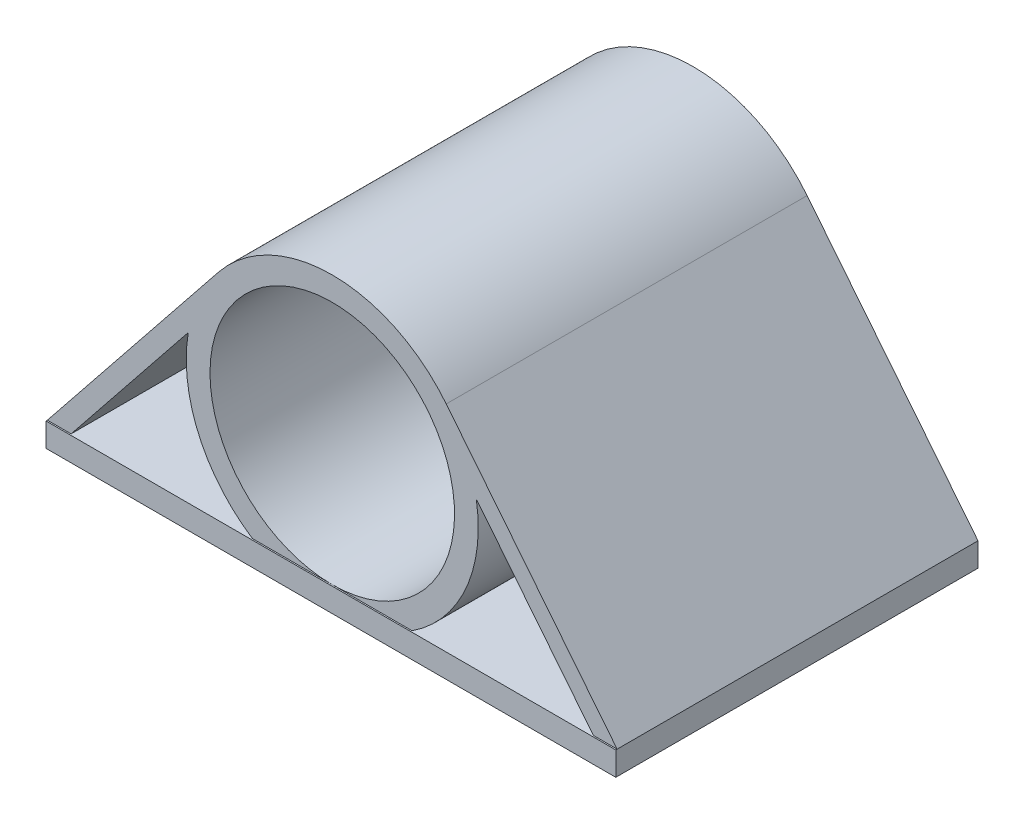
ISO-10303-21;
HEADER;
FILE_DESCRIPTION(('STEP AP214'),'2;1');
FILE_NAME('part.step','',(''),(''),'','','');
FILE_SCHEMA(('AUTOMOTIVE_DESIGN { 1 0 10303 214 1 1 1 1 }'));
ENDSEC;
DATA;
#1=APPLICATION_CONTEXT('core data for automotive mechanical design processes');
#2=APPLICATION_PROTOCOL_DEFINITION('international standard','automotive_design',2000,#1);
#3=PRODUCT_CONTEXT('',#1,'mechanical');
#4=PRODUCT('Part','Part','',(#3));
#5=PRODUCT_RELATED_PRODUCT_CATEGORY('part','',(#4));
#6=PRODUCT_DEFINITION_FORMATION('','',#4);
#7=PRODUCT_DEFINITION_CONTEXT('part definition',#1,'design');
#8=PRODUCT_DEFINITION('design','',#6,#7);
#9=PRODUCT_DEFINITION_SHAPE('','',#8);
#10=(LENGTH_UNIT() NAMED_UNIT(*) SI_UNIT(.MILLI.,.METRE.));
#11=(NAMED_UNIT(*) PLANE_ANGLE_UNIT() SI_UNIT($,.RADIAN.));
#12=(NAMED_UNIT(*) SI_UNIT($,.STERADIAN.) SOLID_ANGLE_UNIT());
#13=UNCERTAINTY_MEASURE_WITH_UNIT(LENGTH_MEASURE(1.E-05),#10,'distance_accuracy_value','');
#14=(GEOMETRIC_REPRESENTATION_CONTEXT(3) GLOBAL_UNCERTAINTY_ASSIGNED_CONTEXT((#13)) GLOBAL_UNIT_ASSIGNED_CONTEXT((#10,
#11,#12)) REPRESENTATION_CONTEXT('',''));
#15=CARTESIAN_POINT('',(0.,0.,0.));
#16=DIRECTION('',(0.,0.,1.));
#17=DIRECTION('',(1.,0.,0.));
#18=AXIS2_PLACEMENT_3D('',#15,#16,#17);
#19=CARTESIAN_POINT('',(0.,0.,76.));
#20=DIRECTION('',(0.,0.,-1.));
#21=DIRECTION('',(-1.,0.,0.));
#22=AXIS2_PLACEMENT_3D('',#19,#20,#21);
#23=CYLINDRICAL_SURFACE('',#22,30.75);
#24=CARTESIAN_POINT('',(0.,0.,0.));
#25=DIRECTION('',(0.,0.,1.));
#26=DIRECTION('',(1.,0.,0.));
#27=AXIS2_PLACEMENT_3D('',#24,#25,#26);
#28=CIRCLE('',#27,30.75);
#29=CARTESIAN_POINT('',(24.0063013122993,19.216138980115,0.));
#30=VERTEX_POINT('',#29);
#31=CARTESIAN_POINT('',(-24.0063013122988,19.2161389801157,0.));
#32=VERTEX_POINT('',#31);
#33=EDGE_CURVE('E166',#30,#32,#28,.T.);
#34=ORIENTED_EDGE('',*,*,#33,.T.);
#35=DIRECTION('',(0.,0.,1.));
#36=VECTOR('',#35,1.);
#37=CARTESIAN_POINT('',(-24.0063013122988,19.2161389801157,0.));
#38=LINE('',#37,#36);
#39=CARTESIAN_POINT('',(-24.0063013122988,19.2161389801157,76.));
#40=VERTEX_POINT('',#39);
#41=EDGE_CURVE('E162',#32,#40,#38,.T.);
#42=ORIENTED_EDGE('',*,*,#41,.T.);
#43=CARTESIAN_POINT('',(0.,0.,76.));
#44=DIRECTION('',(0.,0.,1.));
#45=DIRECTION('',(1.,0.,0.));
#46=AXIS2_PLACEMENT_3D('',#43,#44,#45);
#47=CIRCLE('',#46,30.75);
#48=CARTESIAN_POINT('',(24.0063013122993,19.216138980115,76.));
#49=VERTEX_POINT('',#48);
#50=EDGE_CURVE('E52',#49,#40,#47,.T.);
#51=ORIENTED_EDGE('',*,*,#50,.F.);
#52=DIRECTION('',(0.,0.,1.));
#53=VECTOR('',#52,1.);
#54=CARTESIAN_POINT('',(24.0063013122993,19.216138980115,0.));
#55=LINE('',#54,#53);
#56=EDGE_CURVE('E253',#30,#49,#55,.T.);
#57=ORIENTED_EDGE('',*,*,#56,.F.);
#58=EDGE_LOOP('',(#34,#42,#51,#57));
#59=FACE_BOUND('',#58,.T.);
#60=ADVANCED_FACE('F43',(#59),#23,.T.);
#61=CARTESIAN_POINT('',(-30.3289964603221,5.07094406494202,76.));
#62=VERTEX_POINT('',#61);
#63=CARTESIAN_POINT('',(-16.8077363139716,-25.75,76.));
#64=VERTEX_POINT('',#63);
#65=EDGE_CURVE('E53',#62,#64,#47,.T.);
#66=ORIENTED_EDGE('',*,*,#65,.F.);
#67=DIRECTION('',(0.,0.,1.));
#68=VECTOR('',#67,1.);
#69=CARTESIAN_POINT('',(-30.3289964603221,5.070944064942,0.));
#70=LINE('',#69,#68);
#71=CARTESIAN_POINT('',(-30.3289964603221,5.070944064942,0.));
#72=VERTEX_POINT('',#71);
#73=EDGE_CURVE('E148',#72,#62,#70,.T.);
#74=ORIENTED_EDGE('',*,*,#73,.F.);
#75=CARTESIAN_POINT('',(-16.8077363139716,-25.75,0.));
#76=VERTEX_POINT('',#75);
#77=EDGE_CURVE('E160',#72,#76,#28,.T.);
#78=ORIENTED_EDGE('',*,*,#77,.T.);
#79=DIRECTION('',(0.,0.,-1.));
#80=VECTOR('',#79,1.);
#81=CARTESIAN_POINT('',(-16.8077363139716,-25.75,76.));
#82=LINE('',#81,#80);
#83=EDGE_CURVE('E205',#76,#64,#82,.F.);
#84=ORIENTED_EDGE('',*,*,#83,.T.);
#85=EDGE_LOOP('',(#66,#74,#78,#84));
#86=FACE_BOUND('',#85,.T.);
#87=ADVANCED_FACE('F158',(#86),#23,.T.);
#88=CARTESIAN_POINT('',(0.,0.,76.));
#89=DIRECTION('',(0.,0.,-1.));
#90=DIRECTION('',(-1.,0.,0.));
#91=AXIS2_PLACEMENT_3D('',#88,#89,#90);
#92=CYLINDRICAL_SURFACE('',#91,25.75);
#93=CARTESIAN_POINT('',(0.,0.,5.));
#94=DIRECTION('',(0.,0.,-1.));
#95=DIRECTION('',(-1.,0.,0.));
#96=AXIS2_PLACEMENT_3D('',#93,#94,#95);
#97=CIRCLE('',#96,25.75);
#98=CARTESIAN_POINT('',(-25.75,0.,5.));
#99=VERTEX_POINT('',#98);
#100=EDGE_CURVE('E170',#99,#99,#97,.T.);
#101=ORIENTED_EDGE('',*,*,#100,.T.);
#102=EDGE_LOOP('',(#101));
#103=FACE_BOUND('',#102,.T.);
#104=CARTESIAN_POINT('',(0.,0.,76.));
#105=DIRECTION('',(0.,0.,1.));
#106=DIRECTION('',(1.,0.,0.));
#107=AXIS2_PLACEMENT_3D('',#104,#105,#106);
#108=CIRCLE('',#107,25.75);
#109=CARTESIAN_POINT('',(0.,-25.75,76.));
#110=VERTEX_POINT('',#109);
#111=EDGE_CURVE('E167',#110,#110,#108,.T.);
#112=ORIENTED_EDGE('',*,*,#111,.T.);
#113=EDGE_LOOP('',(#112));
#114=FACE_BOUND('',#113,.T.);
#115=ADVANCED_FACE('F300',(#103,#114),#92,.F.);
#116=CARTESIAN_POINT('',(0.,0.,76.));
#117=DIRECTION('',(0.,0.,1.));
#118=DIRECTION('',(1.,0.,0.));
#119=AXIS2_PLACEMENT_3D('',#116,#117,#118);
#120=PLANE('',#119);
#121=ORIENTED_EDGE('',*,*,#50,.T.);
#122=DIRECTION('',(-0.624915088784227,-0.780692725603231,0.));
#123=VECTOR('',#122,1.);
#124=CARTESIAN_POINT('',(-60.,-25.75,76.));
#125=LINE('',#124,#123);
#126=CARTESIAN_POINT('',(-60.,-25.75,76.));
#127=VERTEX_POINT('',#126);
#128=EDGE_CURVE('E155',#40,#127,#125,.T.);
#129=ORIENTED_EDGE('',*,*,#128,.T.);
#130=DIRECTION('',(1.,0.,0.));
#131=VECTOR('',#130,1.);
#132=CARTESIAN_POINT('',(-60.,-25.75,76.));
#133=LINE('',#132,#131);
#134=CARTESIAN_POINT('',(-54.9999999999985,-25.75,76.));
#135=VERTEX_POINT('',#134);
#136=EDGE_CURVE('E249',#127,#135,#133,.T.);
#137=ORIENTED_EDGE('',*,*,#136,.T.);
#138=DIRECTION('',(0.624915088784227,0.780692725603231,0.));
#139=VECTOR('',#138,1.);
#140=CARTESIAN_POINT('',(-54.9999999999985,-25.75,76.));
#141=LINE('',#140,#139);
#142=EDGE_CURVE('E60',#135,#62,#141,.T.);
#143=ORIENTED_EDGE('',*,*,#142,.T.);
#144=ORIENTED_EDGE('',*,*,#65,.T.);
#145=DIRECTION('',(-1.,0.,0.));
#146=VECTOR('',#145,1.);
#147=CARTESIAN_POINT('',(0.,-25.75,76.));
#148=LINE('',#147,#146);
#149=EDGE_CURVE('E203',#110,#64,#148,.T.);
#150=ORIENTED_EDGE('',*,*,#149,.F.);
#151=ORIENTED_EDGE('',*,*,#111,.F.);
#152=CARTESIAN_POINT('',(16.8077363139716,-25.75,76.));
#153=VERTEX_POINT('',#152);
#154=EDGE_CURVE('E202',#153,#110,#148,.T.);
#155=ORIENTED_EDGE('',*,*,#154,.F.);
#156=CARTESIAN_POINT('',(30.3289964603221,5.070944064942,76.));
#157=VERTEX_POINT('',#156);
#158=EDGE_CURVE('E11',#153,#157,#47,.T.);
#159=ORIENTED_EDGE('',*,*,#158,.T.);
#160=DIRECTION('',(0.624915088784227,-0.780692725603231,0.));
#161=VECTOR('',#160,1.);
#162=CARTESIAN_POINT('',(54.9999999999985,-25.75,76.));
#163=LINE('',#162,#161);
#164=CARTESIAN_POINT('',(54.9999999999985,-25.75,76.));
#165=VERTEX_POINT('',#164);
#166=EDGE_CURVE('E246',#157,#165,#163,.T.);
#167=ORIENTED_EDGE('',*,*,#166,.T.);
#168=DIRECTION('',(1.,0.,0.));
#169=VECTOR('',#168,1.);
#170=CARTESIAN_POINT('',(60.,-25.75,76.));
#171=LINE('',#170,#169);
#172=CARTESIAN_POINT('',(60.,-25.75,76.));
#173=VERTEX_POINT('',#172);
#174=EDGE_CURVE('E250',#165,#173,#171,.T.);
#175=ORIENTED_EDGE('',*,*,#174,.T.);
#176=DIRECTION('',(-0.624915088784227,0.780692725603231,0.));
#177=VECTOR('',#176,1.);
#178=CARTESIAN_POINT('',(60.,-25.75,76.));
#179=LINE('',#178,#177);
#180=EDGE_CURVE('E67',#173,#49,#179,.T.);
#181=ORIENTED_EDGE('',*,*,#180,.T.);
#182=EDGE_LOOP('',(#121,#129,#137,#143,#144,#150,#151,#155,#159,#167,#175,#181));
#183=FACE_BOUND('',#182,.T.);
#184=ADVANCED_FACE('F298',(#183),#120,.T.);
#185=CARTESIAN_POINT('',(0.,0.,0.));
#186=DIRECTION('',(0.,0.,1.));
#187=DIRECTION('',(1.,0.,0.));
#188=AXIS2_PLACEMENT_3D('',#185,#186,#187);
#189=PLANE('',#188);
#190=DIRECTION('',(-0.624915088784227,-0.780692725603231,0.));
#191=VECTOR('',#190,1.);
#192=CARTESIAN_POINT('',(-60.,-25.75,0.));
#193=LINE('',#192,#191);
#194=CARTESIAN_POINT('',(-60.,-25.75,0.));
#195=VERTEX_POINT('',#194);
#196=EDGE_CURVE('E154',#32,#195,#193,.T.);
#197=ORIENTED_EDGE('',*,*,#196,.F.);
#198=ORIENTED_EDGE('',*,*,#33,.F.);
#199=DIRECTION('',(-0.624915088784227,0.780692725603231,0.));
#200=VECTOR('',#199,1.);
#201=CARTESIAN_POINT('',(60.,-25.75,0.));
#202=LINE('',#201,#200);
#203=CARTESIAN_POINT('',(60.,-25.75,0.));
#204=VERTEX_POINT('',#203);
#205=EDGE_CURVE('E243',#204,#30,#202,.T.);
#206=ORIENTED_EDGE('',*,*,#205,.F.);
#207=DIRECTION('',(0.,-1.,0.));
#208=VECTOR('',#207,1.);
#209=CARTESIAN_POINT('',(60.,-25.75,0.));
#210=LINE('',#209,#208);
#211=CARTESIAN_POINT('',(60.,-30.75,0.));
#212=VERTEX_POINT('',#211);
#213=EDGE_CURVE('E213',#204,#212,#210,.T.);
#214=ORIENTED_EDGE('',*,*,#213,.T.);
#215=DIRECTION('',(-1.,0.,0.));
#216=VECTOR('',#215,1.);
#217=CARTESIAN_POINT('',(60.,-30.75,0.));
#218=LINE('',#217,#216);
#219=CARTESIAN_POINT('',(-60.,-30.75,0.));
#220=VERTEX_POINT('',#219);
#221=EDGE_CURVE('E220',#212,#220,#218,.T.);
#222=ORIENTED_EDGE('',*,*,#221,.T.);
#223=DIRECTION('',(0.,-1.,0.));
#224=VECTOR('',#223,1.);
#225=CARTESIAN_POINT('',(-60.,-25.75,0.));
#226=LINE('',#225,#224);
#227=EDGE_CURVE('E216',#195,#220,#226,.T.);
#228=ORIENTED_EDGE('',*,*,#227,.F.);
#229=EDGE_LOOP('',(#197,#198,#206,#214,#222,#228));
#230=FACE_BOUND('',#229,.T.);
#231=DIRECTION('',(0.624915088784227,-0.780692725603231,0.));
#232=VECTOR('',#231,1.);
#233=CARTESIAN_POINT('',(54.9999999999985,-25.75,0.));
#234=LINE('',#233,#232);
#235=CARTESIAN_POINT('',(30.3289964603221,5.070944064942,0.));
#236=VERTEX_POINT('',#235);
#237=CARTESIAN_POINT('',(54.9999999999985,-25.75,0.));
#238=VERTEX_POINT('',#237);
#239=EDGE_CURVE('E240',#236,#238,#234,.T.);
#240=ORIENTED_EDGE('',*,*,#239,.F.);
#241=CARTESIAN_POINT('',(16.8077363139716,-25.75,0.));
#242=VERTEX_POINT('',#241);
#243=EDGE_CURVE('E47',#242,#236,#28,.T.);
#244=ORIENTED_EDGE('',*,*,#243,.F.);
#245=DIRECTION('',(-1.,0.,0.));
#246=VECTOR('',#245,1.);
#247=CARTESIAN_POINT('',(60.,-25.75,0.));
#248=LINE('',#247,#246);
#249=EDGE_CURVE('E219',#238,#242,#248,.T.);
#250=ORIENTED_EDGE('',*,*,#249,.F.);
#251=EDGE_LOOP('',(#240,#244,#250));
#252=FACE_BOUND('',#251,.T.);
#253=CARTESIAN_POINT('',(-20.,0.,0.));
#254=DIRECTION('',(0.,0.,-1.));
#255=DIRECTION('',(-1.,0.,0.));
#256=AXIS2_PLACEMENT_3D('',#253,#254,#255);
#257=CIRCLE('',#256,2.75);
#258=CARTESIAN_POINT('',(-22.75,0.,0.));
#259=VERTEX_POINT('',#258);
#260=EDGE_CURVE('E196',#259,#259,#257,.T.);
#261=ORIENTED_EDGE('',*,*,#260,.F.);
#262=EDGE_LOOP('',(#261));
#263=FACE_BOUND('',#262,.T.);
#264=CARTESIAN_POINT('',(20.,0.,0.));
#265=DIRECTION('',(0.,0.,-1.));
#266=DIRECTION('',(1.,0.,0.));
#267=AXIS2_PLACEMENT_3D('',#264,#265,#266);
#268=CIRCLE('',#267,2.75);
#269=CARTESIAN_POINT('',(22.75,0.,0.));
#270=VERTEX_POINT('',#269);
#271=EDGE_CURVE('E192',#270,#270,#268,.T.);
#272=ORIENTED_EDGE('',*,*,#271,.F.);
#273=EDGE_LOOP('',(#272));
#274=FACE_BOUND('',#273,.T.);
#275=CARTESIAN_POINT('',(0.,0.,0.));
#276=DIRECTION('',(0.,0.,-1.));
#277=DIRECTION('',(-1.,0.,0.));
#278=AXIS2_PLACEMENT_3D('',#275,#276,#277);
#279=CIRCLE('',#278,10.75);
#280=CARTESIAN_POINT('',(-10.75,0.,0.));
#281=VERTEX_POINT('',#280);
#282=EDGE_CURVE('E183',#281,#281,#279,.T.);
#283=ORIENTED_EDGE('',*,*,#282,.F.);
#284=EDGE_LOOP('',(#283));
#285=FACE_BOUND('',#284,.T.);
#286=ORIENTED_EDGE('',*,*,#77,.F.);
#287=DIRECTION('',(0.624915088784227,0.780692725603231,0.));
#288=VECTOR('',#287,1.);
#289=CARTESIAN_POINT('',(-54.9999999999985,-25.75,0.));
#290=LINE('',#289,#288);
#291=CARTESIAN_POINT('',(-54.9999999999985,-25.75,0.));
#292=VERTEX_POINT('',#291);
#293=EDGE_CURVE('E145',#292,#72,#290,.T.);
#294=ORIENTED_EDGE('',*,*,#293,.F.);
#295=EDGE_CURVE('E165',#76,#292,#248,.T.);
#296=ORIENTED_EDGE('',*,*,#295,.F.);
#297=EDGE_LOOP('',(#286,#294,#296));
#298=FACE_BOUND('',#297,.T.);
#299=ADVANCED_FACE('F164',(#230,#252,#263,#274,#285,#298),#189,.F.);
#300=ORIENTED_EDGE('',*,*,#243,.T.);
#301=DIRECTION('',(0.,0.,1.));
#302=VECTOR('',#301,1.);
#303=CARTESIAN_POINT('',(30.3289964603221,5.070944064942,0.));
#304=LINE('',#303,#302);
#305=EDGE_CURVE('E245',#236,#157,#304,.T.);
#306=ORIENTED_EDGE('',*,*,#305,.T.);
#307=ORIENTED_EDGE('',*,*,#158,.F.);
#308=DIRECTION('',(0.,0.,-1.));
#309=VECTOR('',#308,1.);
#310=CARTESIAN_POINT('',(16.8077363139716,-25.75,76.));
#311=LINE('',#310,#309);
#312=EDGE_CURVE('E193',#153,#242,#311,.T.);
#313=ORIENTED_EDGE('',*,*,#312,.T.);
#314=EDGE_LOOP('',(#300,#306,#307,#313));
#315=FACE_BOUND('',#314,.T.);
#316=ADVANCED_FACE('F45',(#315),#23,.T.);
#317=CARTESIAN_POINT('',(0.,0.,5.));
#318=DIRECTION('',(0.,0.,-1.));
#319=DIRECTION('',(-1.,0.,0.));
#320=AXIS2_PLACEMENT_3D('',#317,#318,#319);
#321=PLANE('',#320);
#322=CARTESIAN_POINT('',(-20.,0.,5.));
#323=DIRECTION('',(0.,0.,-1.));
#324=DIRECTION('',(-1.,0.,0.));
#325=AXIS2_PLACEMENT_3D('',#322,#323,#324);
#326=CIRCLE('',#325,2.75);
#327=CARTESIAN_POINT('',(-22.75,0.,5.));
#328=VERTEX_POINT('',#327);
#329=EDGE_CURVE('E186',#328,#328,#326,.T.);
#330=ORIENTED_EDGE('',*,*,#329,.T.);
#331=EDGE_LOOP('',(#330));
#332=FACE_BOUND('',#331,.T.);
#333=CARTESIAN_POINT('',(20.,0.,5.));
#334=DIRECTION('',(0.,0.,-1.));
#335=DIRECTION('',(1.,0.,0.));
#336=AXIS2_PLACEMENT_3D('',#333,#334,#335);
#337=CIRCLE('',#336,2.75);
#338=CARTESIAN_POINT('',(22.75,0.,5.));
#339=VERTEX_POINT('',#338);
#340=EDGE_CURVE('E189',#339,#339,#337,.T.);
#341=ORIENTED_EDGE('',*,*,#340,.T.);
#342=EDGE_LOOP('',(#341));
#343=FACE_BOUND('',#342,.T.);
#344=CARTESIAN_POINT('',(0.,0.,5.));
#345=DIRECTION('',(0.,0.,-1.));
#346=DIRECTION('',(-1.,0.,0.));
#347=AXIS2_PLACEMENT_3D('',#344,#345,#346);
#348=CIRCLE('',#347,10.75);
#349=CARTESIAN_POINT('',(-10.75,0.,5.));
#350=VERTEX_POINT('',#349);
#351=EDGE_CURVE('E182',#350,#350,#348,.T.);
#352=ORIENTED_EDGE('',*,*,#351,.T.);
#353=EDGE_LOOP('',(#352));
#354=FACE_BOUND('',#353,.T.);
#355=ORIENTED_EDGE('',*,*,#100,.F.);
#356=EDGE_LOOP('',(#355));
#357=FACE_BOUND('',#356,.T.);
#358=ADVANCED_FACE('F314',(#332,#343,#354,#357),#321,.F.);
#359=CARTESIAN_POINT('',(0.,0.,5.));
#360=DIRECTION('',(0.,0.,-1.));
#361=DIRECTION('',(-1.,0.,0.));
#362=AXIS2_PLACEMENT_3D('',#359,#360,#361);
#363=CYLINDRICAL_SURFACE('',#362,10.75);
#364=ORIENTED_EDGE('',*,*,#351,.F.);
#365=EDGE_LOOP('',(#364));
#366=FACE_BOUND('',#365,.T.);
#367=ORIENTED_EDGE('',*,*,#282,.T.);
#368=EDGE_LOOP('',(#367));
#369=FACE_BOUND('',#368,.T.);
#370=ADVANCED_FACE('F319',(#366,#369),#363,.F.);
#371=CARTESIAN_POINT('',(20.,0.,5.));
#372=DIRECTION('',(0.,0.,-1.));
#373=DIRECTION('',(-1.,0.,0.));
#374=AXIS2_PLACEMENT_3D('',#371,#372,#373);
#375=CYLINDRICAL_SURFACE('',#374,2.75);
#376=ORIENTED_EDGE('',*,*,#340,.F.);
#377=EDGE_LOOP('',(#376));
#378=FACE_BOUND('',#377,.T.);
#379=ORIENTED_EDGE('',*,*,#271,.T.);
#380=EDGE_LOOP('',(#379));
#381=FACE_BOUND('',#380,.T.);
#382=ADVANCED_FACE('F326',(#378,#381),#375,.F.);
#383=CARTESIAN_POINT('',(-20.,0.,5.));
#384=DIRECTION('',(0.,0.,-1.));
#385=DIRECTION('',(-1.,0.,0.));
#386=AXIS2_PLACEMENT_3D('',#383,#384,#385);
#387=CYLINDRICAL_SURFACE('',#386,2.75);
#388=ORIENTED_EDGE('',*,*,#329,.F.);
#389=EDGE_LOOP('',(#388));
#390=FACE_BOUND('',#389,.T.);
#391=ORIENTED_EDGE('',*,*,#260,.T.);
#392=EDGE_LOOP('',(#391));
#393=FACE_BOUND('',#392,.T.);
#394=ADVANCED_FACE('F333',(#390,#393),#387,.F.);
#395=CARTESIAN_POINT('',(0.,-25.75,0.));
#396=DIRECTION('',(0.,1.,0.));
#397=DIRECTION('',(0.,0.,1.));
#398=AXIS2_PLACEMENT_3D('',#395,#396,#397);
#399=PLANE('',#398);
#400=DIRECTION('',(0.,0.,1.));
#401=VECTOR('',#400,1.);
#402=CARTESIAN_POINT('',(-54.9999999999985,-25.75,0.));
#403=LINE('',#402,#401);
#404=EDGE_CURVE('E150',#292,#135,#403,.T.);
#405=ORIENTED_EDGE('',*,*,#404,.T.);
#406=ORIENTED_EDGE('',*,*,#136,.F.);
#407=DIRECTION('',(0.,0.,1.));
#408=VECTOR('',#407,1.);
#409=CARTESIAN_POINT('',(-60.,-25.75,0.));
#410=LINE('',#409,#408);
#411=CARTESIAN_POINT('',(-60.,-25.75,76.2883160847423));
#412=VERTEX_POINT('',#411);
#413=EDGE_CURVE('E222',#127,#412,#410,.T.);
#414=ORIENTED_EDGE('',*,*,#413,.T.);
#415=DIRECTION('',(1.,0.,0.));
#416=VECTOR('',#415,1.);
#417=CARTESIAN_POINT('',(-60.,-25.75,76.2883160847423));
#418=LINE('',#417,#416);
#419=CARTESIAN_POINT('',(60.,-25.75,76.2883160847423));
#420=VERTEX_POINT('',#419);
#421=EDGE_CURVE('E235',#412,#420,#418,.T.);
#422=ORIENTED_EDGE('',*,*,#421,.T.);
#423=DIRECTION('',(0.,0.,-1.));
#424=VECTOR('',#423,1.);
#425=CARTESIAN_POINT('',(60.,-25.75,76.2883160847423));
#426=LINE('',#425,#424);
#427=EDGE_CURVE('E232',#420,#173,#426,.T.);
#428=ORIENTED_EDGE('',*,*,#427,.T.);
#429=ORIENTED_EDGE('',*,*,#174,.F.);
#430=DIRECTION('',(0.,0.,1.));
#431=VECTOR('',#430,1.);
#432=CARTESIAN_POINT('',(54.9999999999985,-25.75,0.));
#433=LINE('',#432,#431);
#434=EDGE_CURVE('E257',#238,#165,#433,.T.);
#435=ORIENTED_EDGE('',*,*,#434,.F.);
#436=ORIENTED_EDGE('',*,*,#249,.T.);
#437=ORIENTED_EDGE('',*,*,#312,.F.);
#438=ORIENTED_EDGE('',*,*,#154,.T.);
#439=ORIENTED_EDGE('',*,*,#149,.T.);
#440=ORIENTED_EDGE('',*,*,#83,.F.);
#441=ORIENTED_EDGE('',*,*,#295,.T.);
#442=EDGE_LOOP('',(#405,#406,#414,#422,#428,#429,#435,#436,#437,#438,#439,#440,#441));
#443=FACE_BOUND('',#442,.T.);
#444=ADVANCED_FACE('F297',(#443),#399,.T.);
#445=CARTESIAN_POINT('',(-60.,-25.75,0.));
#446=DIRECTION('',(1.,0.,0.));
#447=DIRECTION('',(0.,0.,-1.));
#448=AXIS2_PLACEMENT_3D('',#445,#446,#447);
#449=PLANE('',#448);
#450=DIRECTION('',(0.,0.,1.));
#451=VECTOR('',#450,1.);
#452=CARTESIAN_POINT('',(-60.,-30.75,0.));
#453=LINE('',#452,#451);
#454=CARTESIAN_POINT('',(-60.,-30.75,76.2883160847423));
#455=VERTEX_POINT('',#454);
#456=EDGE_CURVE('E228',#220,#455,#453,.T.);
#457=ORIENTED_EDGE('',*,*,#456,.T.);
#458=DIRECTION('',(0.,-1.,0.));
#459=VECTOR('',#458,1.);
#460=CARTESIAN_POINT('',(-60.,-25.75,76.2883160847423));
#461=LINE('',#460,#459);
#462=EDGE_CURVE('E207',#412,#455,#461,.T.);
#463=ORIENTED_EDGE('',*,*,#462,.F.);
#464=ORIENTED_EDGE('',*,*,#413,.F.);
#465=EDGE_CURVE('E237',#195,#127,#410,.T.);
#466=ORIENTED_EDGE('',*,*,#465,.F.);
#467=ORIENTED_EDGE('',*,*,#227,.T.);
#468=EDGE_LOOP('',(#457,#463,#464,#466,#467));
#469=FACE_BOUND('',#468,.T.);
#470=ADVANCED_FACE('F293',(#469),#449,.F.);
#471=CARTESIAN_POINT('',(-60.,-25.75,76.2883160847423));
#472=DIRECTION('',(0.,0.,-1.));
#473=DIRECTION('',(-1.,0.,0.));
#474=AXIS2_PLACEMENT_3D('',#471,#472,#473);
#475=PLANE('',#474);
#476=DIRECTION('',(1.,0.,0.));
#477=VECTOR('',#476,1.);
#478=CARTESIAN_POINT('',(-60.,-30.75,76.2883160847423));
#479=LINE('',#478,#477);
#480=CARTESIAN_POINT('',(60.,-30.75,76.2883160847423));
#481=VERTEX_POINT('',#480);
#482=EDGE_CURVE('E226',#455,#481,#479,.T.);
#483=ORIENTED_EDGE('',*,*,#482,.T.);
#484=DIRECTION('',(0.,-1.,0.));
#485=VECTOR('',#484,1.);
#486=CARTESIAN_POINT('',(60.,-25.75,76.2883160847423));
#487=LINE('',#486,#485);
#488=EDGE_CURVE('E210',#420,#481,#487,.T.);
#489=ORIENTED_EDGE('',*,*,#488,.F.);
#490=ORIENTED_EDGE('',*,*,#421,.F.);
#491=ORIENTED_EDGE('',*,*,#462,.T.);
#492=EDGE_LOOP('',(#483,#489,#490,#491));
#493=FACE_BOUND('',#492,.T.);
#494=ADVANCED_FACE('F340',(#493),#475,.F.);
#495=CARTESIAN_POINT('',(60.,-25.75,76.2883160847423));
#496=DIRECTION('',(-1.,0.,0.));
#497=DIRECTION('',(0.,0.,1.));
#498=AXIS2_PLACEMENT_3D('',#495,#496,#497);
#499=PLANE('',#498);
#500=DIRECTION('',(0.,0.,-1.));
#501=VECTOR('',#500,1.);
#502=CARTESIAN_POINT('',(60.,-30.75,76.2883160847423));
#503=LINE('',#502,#501);
#504=EDGE_CURVE('E223',#481,#212,#503,.T.);
#505=ORIENTED_EDGE('',*,*,#504,.T.);
#506=ORIENTED_EDGE('',*,*,#213,.F.);
#507=DIRECTION('',(0.,0.,1.));
#508=VECTOR('',#507,1.);
#509=CARTESIAN_POINT('',(60.,-25.75,0.));
#510=LINE('',#509,#508);
#511=EDGE_CURVE('E255',#204,#173,#510,.T.);
#512=ORIENTED_EDGE('',*,*,#511,.T.);
#513=ORIENTED_EDGE('',*,*,#427,.F.);
#514=ORIENTED_EDGE('',*,*,#488,.T.);
#515=EDGE_LOOP('',(#505,#506,#512,#513,#514));
#516=FACE_BOUND('',#515,.T.);
#517=ADVANCED_FACE('F284',(#516),#499,.F.);
#518=CARTESIAN_POINT('',(0.,-30.75,0.));
#519=DIRECTION('',(0.,1.,0.));
#520=DIRECTION('',(0.,0.,1.));
#521=AXIS2_PLACEMENT_3D('',#518,#519,#520);
#522=PLANE('',#521);
#523=ORIENTED_EDGE('',*,*,#221,.F.);
#524=ORIENTED_EDGE('',*,*,#504,.F.);
#525=ORIENTED_EDGE('',*,*,#482,.F.);
#526=ORIENTED_EDGE('',*,*,#456,.F.);
#527=EDGE_LOOP('',(#523,#524,#525,#526));
#528=FACE_BOUND('',#527,.T.);
#529=ADVANCED_FACE('F289',(#528),#522,.F.);
#530=CARTESIAN_POINT('',(60.,-25.75,0.));
#531=DIRECTION('',(0.780692725603231,0.624915088784227,0.));
#532=DIRECTION('',(-0.624915088784227,0.780692725603231,0.));
#533=AXIS2_PLACEMENT_3D('',#530,#531,#532);
#534=PLANE('',#533);
#535=ORIENTED_EDGE('',*,*,#180,.F.);
#536=ORIENTED_EDGE('',*,*,#511,.F.);
#537=ORIENTED_EDGE('',*,*,#205,.T.);
#538=ORIENTED_EDGE('',*,*,#56,.T.);
#539=EDGE_LOOP('',(#535,#536,#537,#538));
#540=FACE_BOUND('',#539,.T.);
#541=ADVANCED_FACE('F281',(#540),#534,.T.);
#542=CARTESIAN_POINT('',(54.9999999999985,-25.75,0.));
#543=DIRECTION('',(-0.780692725603231,-0.624915088784227,0.));
#544=DIRECTION('',(0.624915088784227,-0.780692725603231,0.));
#545=AXIS2_PLACEMENT_3D('',#542,#543,#544);
#546=PLANE('',#545);
#547=ORIENTED_EDGE('',*,*,#166,.F.);
#548=ORIENTED_EDGE('',*,*,#305,.F.);
#549=ORIENTED_EDGE('',*,*,#239,.T.);
#550=ORIENTED_EDGE('',*,*,#434,.T.);
#551=EDGE_LOOP('',(#547,#548,#549,#550));
#552=FACE_BOUND('',#551,.T.);
#553=ADVANCED_FACE('F349',(#552),#546,.T.);
#554=CARTESIAN_POINT('',(-60.,-25.75,0.));
#555=DIRECTION('',(-0.780692725603231,0.624915088784227,0.));
#556=DIRECTION('',(-0.624915088784227,-0.780692725603231,0.));
#557=AXIS2_PLACEMENT_3D('',#554,#555,#556);
#558=PLANE('',#557);
#559=ORIENTED_EDGE('',*,*,#128,.F.);
#560=ORIENTED_EDGE('',*,*,#41,.F.);
#561=ORIENTED_EDGE('',*,*,#196,.T.);
#562=ORIENTED_EDGE('',*,*,#465,.T.);
#563=EDGE_LOOP('',(#559,#560,#561,#562));
#564=FACE_BOUND('',#563,.T.);
#565=ADVANCED_FACE('F271',(#564),#558,.T.);
#566=CARTESIAN_POINT('',(-54.9999999999985,-25.75,0.));
#567=DIRECTION('',(0.780692725603231,-0.624915088784227,0.));
#568=DIRECTION('',(0.624915088784227,0.780692725603231,0.));
#569=AXIS2_PLACEMENT_3D('',#566,#567,#568);
#570=PLANE('',#569);
#571=ORIENTED_EDGE('',*,*,#142,.F.);
#572=ORIENTED_EDGE('',*,*,#404,.F.);
#573=ORIENTED_EDGE('',*,*,#293,.T.);
#574=ORIENTED_EDGE('',*,*,#73,.T.);
#575=EDGE_LOOP('',(#571,#572,#573,#574));
#576=FACE_BOUND('',#575,.T.);
#577=ADVANCED_FACE('F147',(#576),#570,.T.);
#578=CLOSED_SHELL('',(#60,#87,#115,#184,#299,#316,#358,#370,#382,#394,#444,#470,#494,#517,#529,
#541,#553,#565,#577));
#579=MANIFOLD_SOLID_BREP('B2',#578);
#580=ADVANCED_BREP_SHAPE_REPRESENTATION('',(#18,#579),#14);
#581=SHAPE_DEFINITION_REPRESENTATION(#9,#580);
ENDSEC;
END-ISO-10303-21;
